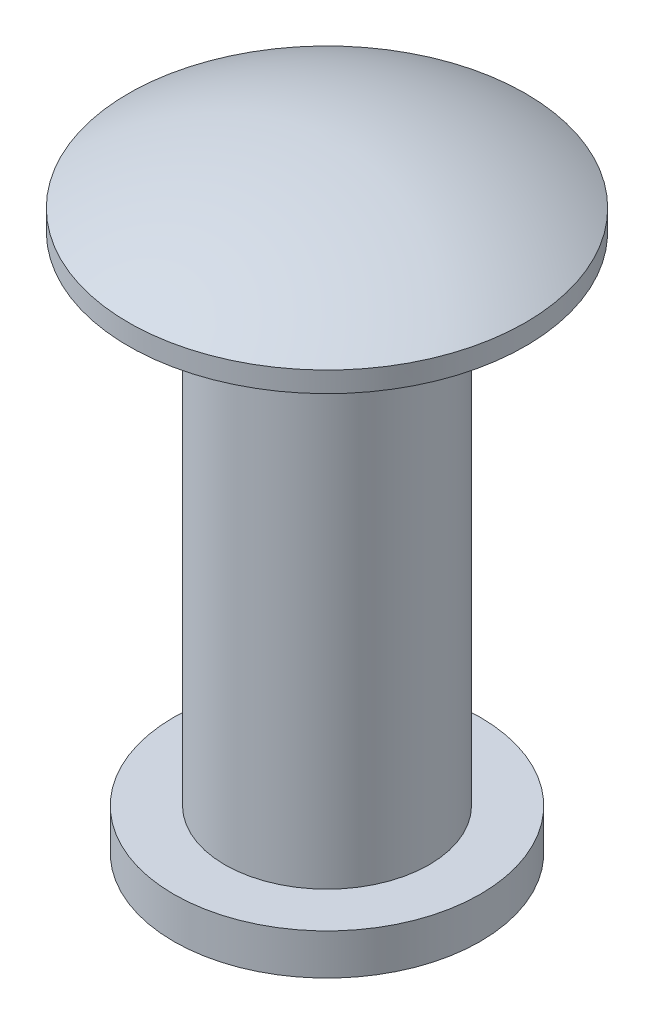
ISO-10303-21;
HEADER;
FILE_DESCRIPTION(('STEP AP214'),'2;1');
FILE_NAME('part.step','',(''),(''),'','','');
FILE_SCHEMA(('AUTOMOTIVE_DESIGN { 1 0 10303 214 1 1 1 1 }'));
ENDSEC;
DATA;
#1=APPLICATION_CONTEXT('core data for automotive mechanical design processes');
#2=APPLICATION_PROTOCOL_DEFINITION('international standard','automotive_design',2000,#1);
#3=PRODUCT_CONTEXT('',#1,'mechanical');
#4=PRODUCT('Part','Part','',(#3));
#5=PRODUCT_RELATED_PRODUCT_CATEGORY('part','',(#4));
#6=PRODUCT_DEFINITION_FORMATION('','',#4);
#7=PRODUCT_DEFINITION_CONTEXT('part definition',#1,'design');
#8=PRODUCT_DEFINITION('design','',#6,#7);
#9=PRODUCT_DEFINITION_SHAPE('','',#8);
#10=(LENGTH_UNIT() NAMED_UNIT(*) SI_UNIT(.MILLI.,.METRE.));
#11=(NAMED_UNIT(*) PLANE_ANGLE_UNIT() SI_UNIT($,.RADIAN.));
#12=(NAMED_UNIT(*) SI_UNIT($,.STERADIAN.) SOLID_ANGLE_UNIT());
#13=UNCERTAINTY_MEASURE_WITH_UNIT(LENGTH_MEASURE(1.E-05),#10,'distance_accuracy_value','');
#14=(GEOMETRIC_REPRESENTATION_CONTEXT(3) GLOBAL_UNCERTAINTY_ASSIGNED_CONTEXT((#13)) GLOBAL_UNIT_ASSIGNED_CONTEXT((#10,
#11,#12)) REPRESENTATION_CONTEXT('',''));
#15=CARTESIAN_POINT('',(0.,0.,0.));
#16=DIRECTION('',(0.,0.,1.));
#17=DIRECTION('',(1.,0.,0.));
#18=AXIS2_PLACEMENT_3D('',#15,#16,#17);
#19=CARTESIAN_POINT('',(0.,-22.0432499715459,0.));
#20=DIRECTION('',(0.,-1.,0.));
#21=DIRECTION('',(0.,0.,-1.));
#22=AXIS2_PLACEMENT_3D('',#19,#20,#21);
#23=CYLINDRICAL_SURFACE('',#22,9.71191078620954);
#24=CARTESIAN_POINT('',(0.,24.3303027798234,0.));
#25=DIRECTION('',(0.,-1.,0.));
#26=DIRECTION('',(0.,0.,-1.));
#27=AXIS2_PLACEMENT_3D('',#24,#25,#26);
#28=CIRCLE('',#27,9.71191078620954);
#29=CARTESIAN_POINT('',(0.,24.3303027798234,-9.71191078620954));
#30=VERTEX_POINT('',#29);
#31=EDGE_CURVE('E88',#30,#30,#28,.T.);
#32=ORIENTED_EDGE('',*,*,#31,.F.);
#33=EDGE_LOOP('',(#32));
#34=FACE_BOUND('',#33,.T.);
#35=CARTESIAN_POINT('',(0.,25.3303027798234,0.));
#36=DIRECTION('',(0.,-1.,0.));
#37=DIRECTION('',(0.,0.,-1.));
#38=AXIS2_PLACEMENT_3D('',#35,#36,#37);
#39=CIRCLE('',#38,9.71191078620954);
#40=CARTESIAN_POINT('',(0.,25.3303027798234,-9.71191078620954));
#41=VERTEX_POINT('',#40);
#42=EDGE_CURVE('E10',#41,#41,#39,.T.);
#43=ORIENTED_EDGE('',*,*,#42,.T.);
#44=EDGE_LOOP('',(#43));
#45=FACE_BOUND('',#44,.T.);
#46=ADVANCED_FACE('F45',(#34,#45),#23,.T.);
#47=CARTESIAN_POINT('',(0.,9.00000000000001,0.));
#48=DIRECTION('',(0.,-1.,0.));
#49=DIRECTION('',(1.,0.,0.));
#50=AXIS2_PLACEMENT_3D('',#47,#48,#49);
#51=SPHERICAL_SURFACE('',#50,19.);
#52=ORIENTED_EDGE('',*,*,#42,.F.);
#53=EDGE_LOOP('',(#52));
#54=FACE_BOUND('',#53,.T.);
#55=ADVANCED_FACE('F96',(#54),#51,.T.);
#56=CARTESIAN_POINT('',(0.,26.5,0.));
#57=DIRECTION('',(0.,1.,0.));
#58=DIRECTION('',(0.,0.,1.));
#59=AXIS2_PLACEMENT_3D('',#56,#57,#58);
#60=PLANE('',#59);
#61=CARTESIAN_POINT('',(0.,26.5,0.));
#62=DIRECTION('',(0.,-1.,0.));
#63=DIRECTION('',(0.,0.,-1.));
#64=AXIS2_PLACEMENT_3D('',#61,#62,#63);
#65=CIRCLE('',#64,2.5);
#66=CARTESIAN_POINT('',(0.,26.5,-2.5));
#67=VERTEX_POINT('',#66);
#68=EDGE_CURVE('E52',#67,#67,#65,.T.);
#69=ORIENTED_EDGE('',*,*,#68,.T.);
#70=EDGE_LOOP('',(#69));
#71=FACE_BOUND('',#70,.T.);
#72=ADVANCED_FACE('F100',(#71),#60,.F.);
#73=CARTESIAN_POINT('',(0.,-22.0432499715459,0.));
#74=DIRECTION('',(0.,-1.,0.));
#75=DIRECTION('',(0.,0.,-1.));
#76=AXIS2_PLACEMENT_3D('',#73,#74,#75);
#77=CYLINDRICAL_SURFACE('',#76,2.5);
#78=ORIENTED_EDGE('',*,*,#68,.F.);
#79=EDGE_LOOP('',(#78));
#80=FACE_BOUND('',#79,.T.);
#81=CARTESIAN_POINT('',(0.,26.,0.));
#82=DIRECTION('',(0.,-1.,0.));
#83=DIRECTION('',(0.,0.,-1.));
#84=AXIS2_PLACEMENT_3D('',#81,#82,#83);
#85=CIRCLE('',#84,2.5);
#86=CARTESIAN_POINT('',(0.,26.,-2.5));
#87=VERTEX_POINT('',#86);
#88=EDGE_CURVE('E57',#87,#87,#85,.T.);
#89=ORIENTED_EDGE('',*,*,#88,.T.);
#90=EDGE_LOOP('',(#89));
#91=FACE_BOUND('',#90,.T.);
#92=ADVANCED_FACE('F105',(#80,#91),#77,.F.);
#93=CARTESIAN_POINT('',(0.,26.,0.));
#94=DIRECTION('',(0.,-1.,0.));
#95=DIRECTION('',(0.,0.,-1.));
#96=AXIS2_PLACEMENT_3D('',#93,#94,#95);
#97=PLANE('',#96);
#98=CARTESIAN_POINT('',(0.,26.,0.));
#99=DIRECTION('',(0.,-1.,0.));
#100=DIRECTION('',(0.,0.,-1.));
#101=AXIS2_PLACEMENT_3D('',#98,#99,#100);
#102=CIRCLE('',#101,3.75);
#103=CARTESIAN_POINT('',(0.,26.,-3.75));
#104=VERTEX_POINT('',#103);
#105=EDGE_CURVE('E62',#104,#104,#102,.T.);
#106=ORIENTED_EDGE('',*,*,#105,.T.);
#107=EDGE_LOOP('',(#106));
#108=FACE_BOUND('',#107,.T.);
#109=ORIENTED_EDGE('',*,*,#88,.F.);
#110=EDGE_LOOP('',(#109));
#111=FACE_BOUND('',#110,.T.);
#112=ADVANCED_FACE('F110',(#108,#111),#97,.T.);
#113=CARTESIAN_POINT('',(0.,-22.0432499715459,0.));
#114=DIRECTION('',(0.,-1.,0.));
#115=DIRECTION('',(0.,0.,-1.));
#116=AXIS2_PLACEMENT_3D('',#113,#114,#115);
#117=CYLINDRICAL_SURFACE('',#116,3.75);
#118=CARTESIAN_POINT('',(0.,-2.,0.));
#119=DIRECTION('',(0.,-1.,0.));
#120=DIRECTION('',(0.,0.,-1.));
#121=AXIS2_PLACEMENT_3D('',#118,#119,#120);
#122=CIRCLE('',#121,3.75);
#123=CARTESIAN_POINT('',(0.,-2.,-3.75));
#124=VERTEX_POINT('',#123);
#125=EDGE_CURVE('E68',#124,#124,#122,.T.);
#126=ORIENTED_EDGE('',*,*,#125,.T.);
#127=EDGE_LOOP('',(#126));
#128=FACE_BOUND('',#127,.T.);
#129=ORIENTED_EDGE('',*,*,#105,.F.);
#130=EDGE_LOOP('',(#129));
#131=FACE_BOUND('',#130,.T.);
#132=ADVANCED_FACE('F114',(#128,#131),#117,.F.);
#133=CARTESIAN_POINT('',(0.,-2.,0.));
#134=DIRECTION('',(0.,-1.,0.));
#135=DIRECTION('',(0.,0.,-1.));
#136=AXIS2_PLACEMENT_3D('',#133,#134,#135);
#137=PLANE('',#136);
#138=CARTESIAN_POINT('',(0.,-2.,0.));
#139=DIRECTION('',(0.,-1.,0.));
#140=DIRECTION('',(0.,0.,-1.));
#141=AXIS2_PLACEMENT_3D('',#138,#139,#140);
#142=CIRCLE('',#141,7.5);
#143=CARTESIAN_POINT('',(0.,-2.,-7.5));
#144=VERTEX_POINT('',#143);
#145=EDGE_CURVE('E72',#144,#144,#142,.T.);
#146=ORIENTED_EDGE('',*,*,#145,.T.);
#147=EDGE_LOOP('',(#146));
#148=FACE_BOUND('',#147,.T.);
#149=ORIENTED_EDGE('',*,*,#125,.F.);
#150=EDGE_LOOP('',(#149));
#151=FACE_BOUND('',#150,.T.);
#152=ADVANCED_FACE('F118',(#148,#151),#137,.T.);
#153=CARTESIAN_POINT('',(0.,-22.0432499715459,0.));
#154=DIRECTION('',(0.,-1.,0.));
#155=DIRECTION('',(0.,0.,-1.));
#156=AXIS2_PLACEMENT_3D('',#153,#154,#155);
#157=CYLINDRICAL_SURFACE('',#156,7.5);
#158=ORIENTED_EDGE('',*,*,#145,.F.);
#159=EDGE_LOOP('',(#158));
#160=FACE_BOUND('',#159,.T.);
#161=CARTESIAN_POINT('',(0.,0.,0.));
#162=DIRECTION('',(0.,-1.,0.));
#163=DIRECTION('',(0.,0.,-1.));
#164=AXIS2_PLACEMENT_3D('',#161,#162,#163);
#165=CIRCLE('',#164,7.5);
#166=CARTESIAN_POINT('',(0.,0.,-7.5));
#167=VERTEX_POINT('',#166);
#168=EDGE_CURVE('E76',#167,#167,#165,.T.);
#169=ORIENTED_EDGE('',*,*,#168,.T.);
#170=EDGE_LOOP('',(#169));
#171=FACE_BOUND('',#170,.T.);
#172=ADVANCED_FACE('F122',(#160,#171),#157,.T.);
#173=CARTESIAN_POINT('',(0.,0.,0.));
#174=DIRECTION('',(0.,-1.,0.));
#175=DIRECTION('',(0.,0.,-1.));
#176=AXIS2_PLACEMENT_3D('',#173,#174,#175);
#177=PLANE('',#176);
#178=ORIENTED_EDGE('',*,*,#168,.F.);
#179=EDGE_LOOP('',(#178));
#180=FACE_BOUND('',#179,.T.);
#181=CARTESIAN_POINT('',(0.,0.,0.));
#182=DIRECTION('',(0.,-1.,0.));
#183=DIRECTION('',(0.,0.,-1.));
#184=AXIS2_PLACEMENT_3D('',#181,#182,#183);
#185=CIRCLE('',#184,5.);
#186=CARTESIAN_POINT('',(0.,0.,-5.));
#187=VERTEX_POINT('',#186);
#188=EDGE_CURVE('E80',#187,#187,#185,.T.);
#189=ORIENTED_EDGE('',*,*,#188,.T.);
#190=EDGE_LOOP('',(#189));
#191=FACE_BOUND('',#190,.T.);
#192=ADVANCED_FACE('F126',(#180,#191),#177,.F.);
#193=CARTESIAN_POINT('',(0.,-22.0432499715459,0.));
#194=DIRECTION('',(0.,-1.,0.));
#195=DIRECTION('',(0.,0.,-1.));
#196=AXIS2_PLACEMENT_3D('',#193,#194,#195);
#197=CYLINDRICAL_SURFACE('',#196,5.);
#198=CARTESIAN_POINT('',(0.,24.3303027798234,0.));
#199=DIRECTION('',(0.,-1.,0.));
#200=DIRECTION('',(0.,0.,-1.));
#201=AXIS2_PLACEMENT_3D('',#198,#199,#200);
#202=CIRCLE('',#201,5.);
#203=CARTESIAN_POINT('',(0.,24.3303027798234,-5.));
#204=VERTEX_POINT('',#203);
#205=EDGE_CURVE('E84',#204,#204,#202,.T.);
#206=ORIENTED_EDGE('',*,*,#205,.T.);
#207=EDGE_LOOP('',(#206));
#208=FACE_BOUND('',#207,.T.);
#209=ORIENTED_EDGE('',*,*,#188,.F.);
#210=EDGE_LOOP('',(#209));
#211=FACE_BOUND('',#210,.T.);
#212=ADVANCED_FACE('F130',(#208,#211),#197,.T.);
#213=CARTESIAN_POINT('',(0.,24.3303027798234,0.));
#214=DIRECTION('',(0.,1.,0.));
#215=DIRECTION('',(0.,0.,1.));
#216=AXIS2_PLACEMENT_3D('',#213,#214,#215);
#217=PLANE('',#216);
#218=ORIENTED_EDGE('',*,*,#205,.F.);
#219=EDGE_LOOP('',(#218));
#220=FACE_BOUND('',#219,.T.);
#221=ORIENTED_EDGE('',*,*,#31,.T.);
#222=EDGE_LOOP('',(#221));
#223=FACE_BOUND('',#222,.T.);
#224=ADVANCED_FACE('F93',(#220,#223),#217,.F.);
#225=CLOSED_SHELL('',(#46,#55,#72,#92,#112,#132,#152,#172,#192,#212,#224));
#226=MANIFOLD_SOLID_BREP('B2',#225);
#227=ADVANCED_BREP_SHAPE_REPRESENTATION('',(#18,#226),#14);
#228=SHAPE_DEFINITION_REPRESENTATION(#9,#227);
ENDSEC;
END-ISO-10303-21;
